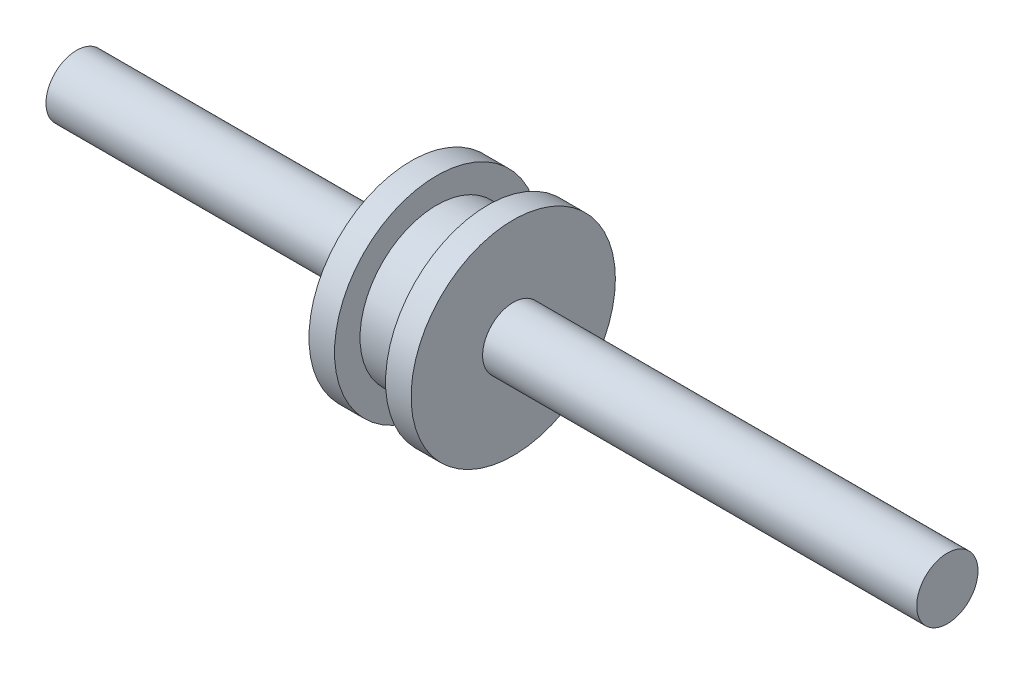
ISO-10303-21;
HEADER;
FILE_DESCRIPTION(('STEP AP214'),'2;1');
FILE_NAME('part.step','',(''),(''),'','','');
FILE_SCHEMA(('AUTOMOTIVE_DESIGN { 1 0 10303 214 1 1 1 1 }'));
ENDSEC;
DATA;
#1=APPLICATION_CONTEXT('core data for automotive mechanical design processes');
#2=APPLICATION_PROTOCOL_DEFINITION('international standard','automotive_design',2000,#1);
#3=PRODUCT_CONTEXT('',#1,'mechanical');
#4=PRODUCT('Part','Part','',(#3));
#5=PRODUCT_RELATED_PRODUCT_CATEGORY('part','',(#4));
#6=PRODUCT_DEFINITION_FORMATION('','',#4);
#7=PRODUCT_DEFINITION_CONTEXT('part definition',#1,'design');
#8=PRODUCT_DEFINITION('design','',#6,#7);
#9=PRODUCT_DEFINITION_SHAPE('','',#8);
#10=(LENGTH_UNIT() NAMED_UNIT(*) SI_UNIT(.MILLI.,.METRE.));
#11=(NAMED_UNIT(*) PLANE_ANGLE_UNIT() SI_UNIT($,.RADIAN.));
#12=(NAMED_UNIT(*) SI_UNIT($,.STERADIAN.) SOLID_ANGLE_UNIT());
#13=UNCERTAINTY_MEASURE_WITH_UNIT(LENGTH_MEASURE(1.E-05),#10,'distance_accuracy_value','');
#14=(GEOMETRIC_REPRESENTATION_CONTEXT(3) GLOBAL_UNCERTAINTY_ASSIGNED_CONTEXT((#13)) GLOBAL_UNIT_ASSIGNED_CONTEXT((#10,
#11,#12)) REPRESENTATION_CONTEXT('',''));
#15=CARTESIAN_POINT('',(0.,0.,0.));
#16=DIRECTION('',(0.,0.,1.));
#17=DIRECTION('',(1.,0.,0.));
#18=AXIS2_PLACEMENT_3D('',#15,#16,#17);
#19=CARTESIAN_POINT('',(65.5,0.,0.));
#20=DIRECTION('',(-1.,0.,0.));
#21=DIRECTION('',(0.,0.,1.));
#22=AXIS2_PLACEMENT_3D('',#19,#20,#21);
#23=CYLINDRICAL_SURFACE('',#22,6.);
#24=CARTESIAN_POINT('',(65.5,0.,0.));
#25=DIRECTION('',(1.,0.,0.));
#26=DIRECTION('',(0.,0.,-1.));
#27=AXIS2_PLACEMENT_3D('',#24,#25,#26);
#28=CIRCLE('',#27,6.);
#29=CARTESIAN_POINT('',(65.5,0.,-6.));
#30=VERTEX_POINT('',#29);
#31=EDGE_CURVE('E55',#30,#30,#28,.T.);
#32=ORIENTED_EDGE('',*,*,#31,.F.);
#33=EDGE_LOOP('',(#32));
#34=FACE_BOUND('',#33,.T.);
#35=CARTESIAN_POINT('',(0.,0.,0.));
#36=DIRECTION('',(1.,0.,0.));
#37=DIRECTION('',(0.,0.,-1.));
#38=AXIS2_PLACEMENT_3D('',#35,#36,#37);
#39=CIRCLE('',#38,6.);
#40=CARTESIAN_POINT('',(0.,0.,-6.));
#41=VERTEX_POINT('',#40);
#42=EDGE_CURVE('E46',#41,#41,#39,.T.);
#43=ORIENTED_EDGE('',*,*,#42,.T.);
#44=EDGE_LOOP('',(#43));
#45=FACE_BOUND('',#44,.T.);
#46=ADVANCED_FACE('F43',(#34,#45),#23,.T.);
#47=CARTESIAN_POINT('',(0.,0.,0.));
#48=DIRECTION('',(1.,0.,0.));
#49=DIRECTION('',(0.,0.,-1.));
#50=AXIS2_PLACEMENT_3D('',#47,#48,#49);
#51=PLANE('',#50);
#52=ORIENTED_EDGE('',*,*,#42,.F.);
#53=EDGE_LOOP('',(#52));
#54=FACE_BOUND('',#53,.T.);
#55=ADVANCED_FACE('F81',(#54),#51,.F.);
#56=CARTESIAN_POINT('',(70.5,0.,0.));
#57=DIRECTION('',(-1.,0.,0.));
#58=DIRECTION('',(0.,0.,1.));
#59=AXIS2_PLACEMENT_3D('',#56,#57,#58);
#60=CYLINDRICAL_SURFACE('',#59,20.);
#61=CARTESIAN_POINT('',(70.5,0.,0.));
#62=DIRECTION('',(1.,0.,0.));
#63=DIRECTION('',(0.,0.,-1.));
#64=AXIS2_PLACEMENT_3D('',#61,#62,#63);
#65=CIRCLE('',#64,20.);
#66=CARTESIAN_POINT('',(70.5,0.,-20.));
#67=VERTEX_POINT('',#66);
#68=EDGE_CURVE('E70',#67,#67,#65,.T.);
#69=ORIENTED_EDGE('',*,*,#68,.F.);
#70=EDGE_LOOP('',(#69));
#71=FACE_BOUND('',#70,.T.);
#72=CARTESIAN_POINT('',(65.5,0.,0.));
#73=DIRECTION('',(1.,0.,0.));
#74=DIRECTION('',(0.,0.,-1.));
#75=AXIS2_PLACEMENT_3D('',#72,#73,#74);
#76=CIRCLE('',#75,20.);
#77=CARTESIAN_POINT('',(65.5,0.,-20.));
#78=VERTEX_POINT('',#77);
#79=EDGE_CURVE('E68',#78,#78,#76,.T.);
#80=ORIENTED_EDGE('',*,*,#79,.T.);
#81=EDGE_LOOP('',(#80));
#82=FACE_BOUND('',#81,.T.);
#83=ADVANCED_FACE('F83',(#71,#82),#60,.T.);
#84=CARTESIAN_POINT('',(70.5,0.,0.));
#85=DIRECTION('',(1.,0.,0.));
#86=DIRECTION('',(0.,0.,-1.));
#87=AXIS2_PLACEMENT_3D('',#84,#85,#86);
#88=PLANE('',#87);
#89=CARTESIAN_POINT('',(70.5,0.,0.));
#90=DIRECTION('',(1.,0.,0.));
#91=DIRECTION('',(0.,0.,-1.));
#92=AXIS2_PLACEMENT_3D('',#89,#90,#91);
#93=CIRCLE('',#92,15.);
#94=CARTESIAN_POINT('',(70.5,0.,-15.));
#95=VERTEX_POINT('',#94);
#96=EDGE_CURVE('E50',#95,#95,#93,.T.);
#97=ORIENTED_EDGE('',*,*,#96,.F.);
#98=EDGE_LOOP('',(#97));
#99=FACE_BOUND('',#98,.T.);
#100=ORIENTED_EDGE('',*,*,#68,.T.);
#101=EDGE_LOOP('',(#100));
#102=FACE_BOUND('',#101,.T.);
#103=ADVANCED_FACE('F88',(#99,#102),#88,.T.);
#104=CARTESIAN_POINT('',(65.5,0.,0.));
#105=DIRECTION('',(1.,0.,0.));
#106=DIRECTION('',(0.,0.,-1.));
#107=AXIS2_PLACEMENT_3D('',#104,#105,#106);
#108=PLANE('',#107);
#109=ORIENTED_EDGE('',*,*,#31,.T.);
#110=EDGE_LOOP('',(#109));
#111=FACE_BOUND('',#110,.T.);
#112=ORIENTED_EDGE('',*,*,#79,.F.);
#113=EDGE_LOOP('',(#112));
#114=FACE_BOUND('',#113,.T.);
#115=ADVANCED_FACE('F93',(#111,#114),#108,.F.);
#116=CARTESIAN_POINT('',(80.5,0.,0.));
#117=DIRECTION('',(-1.,0.,0.));
#118=DIRECTION('',(0.,0.,1.));
#119=AXIS2_PLACEMENT_3D('',#116,#117,#118);
#120=CYLINDRICAL_SURFACE('',#119,15.);
#121=CARTESIAN_POINT('',(80.5,0.,0.));
#122=DIRECTION('',(1.,0.,0.));
#123=DIRECTION('',(0.,0.,-1.));
#124=AXIS2_PLACEMENT_3D('',#121,#122,#123);
#125=CIRCLE('',#124,15.);
#126=CARTESIAN_POINT('',(80.5,0.,-15.));
#127=VERTEX_POINT('',#126);
#128=EDGE_CURVE('E63',#127,#127,#125,.T.);
#129=ORIENTED_EDGE('',*,*,#128,.F.);
#130=EDGE_LOOP('',(#129));
#131=FACE_BOUND('',#130,.T.);
#132=ORIENTED_EDGE('',*,*,#96,.T.);
#133=EDGE_LOOP('',(#132));
#134=FACE_BOUND('',#133,.T.);
#135=ADVANCED_FACE('F96',(#131,#134),#120,.T.);
#136=CARTESIAN_POINT('',(85.5,0.,0.));
#137=DIRECTION('',(-1.,0.,0.));
#138=DIRECTION('',(0.,0.,1.));
#139=AXIS2_PLACEMENT_3D('',#136,#137,#138);
#140=CYLINDRICAL_SURFACE('',#139,20.);
#141=CARTESIAN_POINT('',(85.5,0.,0.));
#142=DIRECTION('',(1.,0.,0.));
#143=DIRECTION('',(0.,0.,-1.));
#144=AXIS2_PLACEMENT_3D('',#141,#142,#143);
#145=CIRCLE('',#144,20.);
#146=CARTESIAN_POINT('',(85.5,0.,-20.));
#147=VERTEX_POINT('',#146);
#148=EDGE_CURVE('E60',#147,#147,#145,.T.);
#149=ORIENTED_EDGE('',*,*,#148,.F.);
#150=EDGE_LOOP('',(#149));
#151=FACE_BOUND('',#150,.T.);
#152=CARTESIAN_POINT('',(80.5,0.,0.));
#153=DIRECTION('',(1.,0.,0.));
#154=DIRECTION('',(0.,0.,-1.));
#155=AXIS2_PLACEMENT_3D('',#152,#153,#154);
#156=CIRCLE('',#155,20.);
#157=CARTESIAN_POINT('',(80.5,0.,-20.));
#158=VERTEX_POINT('',#157);
#159=EDGE_CURVE('E64',#158,#158,#156,.T.);
#160=ORIENTED_EDGE('',*,*,#159,.T.);
#161=EDGE_LOOP('',(#160));
#162=FACE_BOUND('',#161,.T.);
#163=ADVANCED_FACE('F102',(#151,#162),#140,.T.);
#164=CARTESIAN_POINT('',(85.5,0.,0.));
#165=DIRECTION('',(1.,0.,0.));
#166=DIRECTION('',(0.,0.,-1.));
#167=AXIS2_PLACEMENT_3D('',#164,#165,#166);
#168=PLANE('',#167);
#169=CARTESIAN_POINT('',(85.5,0.,0.));
#170=DIRECTION('',(1.,0.,0.));
#171=DIRECTION('',(0.,0.,-1.));
#172=AXIS2_PLACEMENT_3D('',#169,#170,#171);
#173=CIRCLE('',#172,6.);
#174=CARTESIAN_POINT('',(85.5,0.,-6.));
#175=VERTEX_POINT('',#174);
#176=EDGE_CURVE('E10',#175,#175,#173,.T.);
#177=ORIENTED_EDGE('',*,*,#176,.F.);
#178=EDGE_LOOP('',(#177));
#179=FACE_BOUND('',#178,.T.);
#180=ORIENTED_EDGE('',*,*,#148,.T.);
#181=EDGE_LOOP('',(#180));
#182=FACE_BOUND('',#181,.T.);
#183=ADVANCED_FACE('F106',(#179,#182),#168,.T.);
#184=CARTESIAN_POINT('',(80.5,0.,0.));
#185=DIRECTION('',(1.,0.,0.));
#186=DIRECTION('',(0.,0.,-1.));
#187=AXIS2_PLACEMENT_3D('',#184,#185,#186);
#188=PLANE('',#187);
#189=ORIENTED_EDGE('',*,*,#128,.T.);
#190=EDGE_LOOP('',(#189));
#191=FACE_BOUND('',#190,.T.);
#192=ORIENTED_EDGE('',*,*,#159,.F.);
#193=EDGE_LOOP('',(#192));
#194=FACE_BOUND('',#193,.T.);
#195=ADVANCED_FACE('F108',(#191,#194),#188,.F.);
#196=CARTESIAN_POINT('',(170.5,0.,0.));
#197=DIRECTION('',(-1.,0.,0.));
#198=DIRECTION('',(0.,0.,1.));
#199=AXIS2_PLACEMENT_3D('',#196,#197,#198);
#200=CYLINDRICAL_SURFACE('',#199,6.);
#201=CARTESIAN_POINT('',(170.5,0.,0.));
#202=DIRECTION('',(1.,0.,0.));
#203=DIRECTION('',(0.,0.,-1.));
#204=AXIS2_PLACEMENT_3D('',#201,#202,#203);
#205=CIRCLE('',#204,6.);
#206=CARTESIAN_POINT('',(170.5,0.,-6.));
#207=VERTEX_POINT('',#206);
#208=EDGE_CURVE('E59',#207,#207,#205,.T.);
#209=ORIENTED_EDGE('',*,*,#208,.F.);
#210=EDGE_LOOP('',(#209));
#211=FACE_BOUND('',#210,.T.);
#212=ORIENTED_EDGE('',*,*,#176,.T.);
#213=EDGE_LOOP('',(#212));
#214=FACE_BOUND('',#213,.T.);
#215=ADVANCED_FACE('F111',(#211,#214),#200,.T.);
#216=CARTESIAN_POINT('',(170.5,0.,0.));
#217=DIRECTION('',(1.,0.,0.));
#218=DIRECTION('',(0.,0.,-1.));
#219=AXIS2_PLACEMENT_3D('',#216,#217,#218);
#220=PLANE('',#219);
#221=ORIENTED_EDGE('',*,*,#208,.T.);
#222=EDGE_LOOP('',(#221));
#223=FACE_BOUND('',#222,.T.);
#224=ADVANCED_FACE('F118',(#223),#220,.T.);
#225=CLOSED_SHELL('',(#46,#55,#83,#103,#115,#135,#163,#183,#195,#215,#224));
#226=MANIFOLD_SOLID_BREP('B2',#225);
#227=ADVANCED_BREP_SHAPE_REPRESENTATION('',(#18,#226),#14);
#228=SHAPE_DEFINITION_REPRESENTATION(#9,#227);
ENDSEC;
END-ISO-10303-21;
